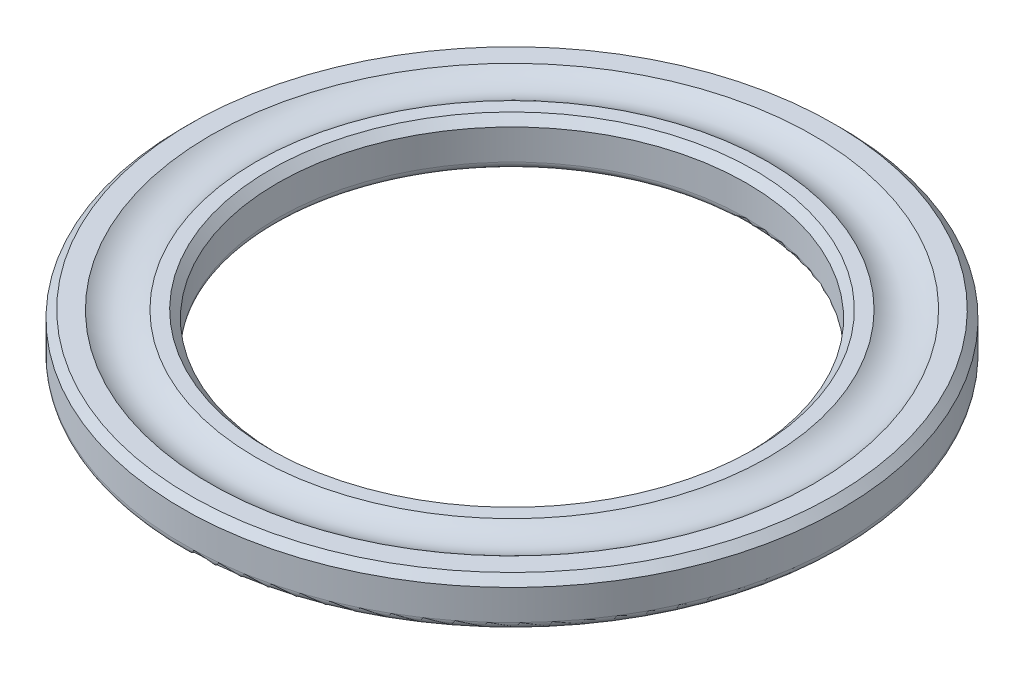
ISO-10303-21;
HEADER;
FILE_DESCRIPTION(('STEP AP214'),'2;1');
FILE_NAME('part.step','',(''),(''),'','','');
FILE_SCHEMA(('AUTOMOTIVE_DESIGN { 1 0 10303 214 1 1 1 1 }'));
ENDSEC;
DATA;
#1=APPLICATION_CONTEXT('core data for automotive mechanical design processes');
#2=APPLICATION_PROTOCOL_DEFINITION('international standard','automotive_design',2000,#1);
#3=PRODUCT_CONTEXT('',#1,'mechanical');
#4=PRODUCT('Part','Part','',(#3));
#5=PRODUCT_RELATED_PRODUCT_CATEGORY('part','',(#4));
#6=PRODUCT_DEFINITION_FORMATION('','',#4);
#7=PRODUCT_DEFINITION_CONTEXT('part definition',#1,'design');
#8=PRODUCT_DEFINITION('design','',#6,#7);
#9=PRODUCT_DEFINITION_SHAPE('','',#8);
#10=(LENGTH_UNIT() NAMED_UNIT(*) SI_UNIT(.MILLI.,.METRE.));
#11=(NAMED_UNIT(*) PLANE_ANGLE_UNIT() SI_UNIT($,.RADIAN.));
#12=(NAMED_UNIT(*) SI_UNIT($,.STERADIAN.) SOLID_ANGLE_UNIT());
#13=UNCERTAINTY_MEASURE_WITH_UNIT(LENGTH_MEASURE(1.E-05),#10,'distance_accuracy_value','');
#14=(GEOMETRIC_REPRESENTATION_CONTEXT(3) GLOBAL_UNCERTAINTY_ASSIGNED_CONTEXT((#13)) GLOBAL_UNIT_ASSIGNED_CONTEXT((#10,
#11,#12)) REPRESENTATION_CONTEXT('',''));
#15=CARTESIAN_POINT('',(0.,0.,0.));
#16=DIRECTION('',(0.,0.,1.));
#17=DIRECTION('',(1.,0.,0.));
#18=AXIS2_PLACEMENT_3D('',#15,#16,#17);
#19=CARTESIAN_POINT('',(22.25,0.,0.));
#20=DIRECTION('',(0.,-1.,0.));
#21=DIRECTION('',(-1.,0.,0.));
#22=AXIS2_PLACEMENT_3D('',#19,#20,#21);
#23=PLANE('',#22);
#24=CARTESIAN_POINT('',(0.,0.,0.));
#25=DIRECTION('',(0.,1.,0.));
#26=DIRECTION('',(1.,0.,0.));
#27=AXIS2_PLACEMENT_3D('',#24,#25,#26);
#28=CIRCLE('',#27,19.1);
#29=CARTESIAN_POINT('',(19.1,0.,0.));
#30=VERTEX_POINT('',#29);
#31=EDGE_CURVE('E11',#30,#30,#28,.T.);
#32=ORIENTED_EDGE('',*,*,#31,.T.);
#33=EDGE_LOOP('',(#32));
#34=FACE_BOUND('',#33,.T.);
#35=CARTESIAN_POINT('',(0.,0.,0.));
#36=DIRECTION('',(0.,1.,0.));
#37=DIRECTION('',(1.,0.,0.));
#38=AXIS2_PLACEMENT_3D('',#35,#36,#37);
#39=CIRCLE('',#38,25.4);
#40=CARTESIAN_POINT('',(25.4,0.,0.));
#41=VERTEX_POINT('',#40);
#42=EDGE_CURVE('E61',#41,#41,#39,.T.);
#43=ORIENTED_EDGE('',*,*,#42,.F.);
#44=EDGE_LOOP('',(#43));
#45=FACE_BOUND('',#44,.T.);
#46=ADVANCED_FACE('F16',(#34,#45),#23,.T.);
#47=CARTESIAN_POINT('',(0.,0.6,0.));
#48=DIRECTION('',(0.,1.,0.));
#49=DIRECTION('',(0.,0.,1.));
#50=AXIS2_PLACEMENT_3D('',#47,#48,#49);
#51=TOROIDAL_SURFACE('',#50,19.1,0.6);
#52=CARTESIAN_POINT('',(0.,0.6,0.));
#53=DIRECTION('',(0.,1.,0.));
#54=DIRECTION('',(1.,0.,0.));
#55=AXIS2_PLACEMENT_3D('',#52,#53,#54);
#56=CIRCLE('',#55,18.5);
#57=CARTESIAN_POINT('',(18.5,0.6,0.));
#58=VERTEX_POINT('',#57);
#59=EDGE_CURVE('E24',#58,#58,#56,.T.);
#60=ORIENTED_EDGE('',*,*,#59,.T.);
#61=EDGE_LOOP('',(#60));
#62=FACE_BOUND('',#61,.T.);
#63=ORIENTED_EDGE('',*,*,#31,.F.);
#64=EDGE_LOOP('',(#63));
#65=FACE_BOUND('',#64,.T.);
#66=ADVANCED_FACE('F18',(#62,#65),#51,.T.);
#67=CARTESIAN_POINT('',(0.,1.8,0.));
#68=DIRECTION('',(0.,-1.,0.));
#69=DIRECTION('',(1.,0.,0.));
#70=AXIS2_PLACEMENT_3D('',#67,#68,#69);
#71=CYLINDRICAL_SURFACE('',#70,18.5);
#72=CARTESIAN_POINT('',(0.,3.,0.));
#73=DIRECTION('',(0.,1.,0.));
#74=DIRECTION('',(1.,0.,0.));
#75=AXIS2_PLACEMENT_3D('',#72,#73,#74);
#76=CIRCLE('',#75,18.5);
#77=CARTESIAN_POINT('',(18.5,3.,0.));
#78=VERTEX_POINT('',#77);
#79=EDGE_CURVE('E74',#78,#78,#76,.T.);
#80=ORIENTED_EDGE('',*,*,#79,.T.);
#81=EDGE_LOOP('',(#80));
#82=FACE_BOUND('',#81,.T.);
#83=ORIENTED_EDGE('',*,*,#59,.F.);
#84=EDGE_LOOP('',(#83));
#85=FACE_BOUND('',#84,.T.);
#86=ADVANCED_FACE('F82',(#82,#85),#71,.F.);
#87=CARTESIAN_POINT('',(0.,3.3,0.));
#88=DIRECTION('',(0.,1.,0.));
#89=DIRECTION('',(1.,0.,0.));
#90=AXIS2_PLACEMENT_3D('',#87,#88,#89);
#91=CONICAL_SURFACE('',#90,18.8,0.785398163397449);
#92=CARTESIAN_POINT('',(0.,3.6,0.));
#93=DIRECTION('',(0.,1.,0.));
#94=DIRECTION('',(1.,0.,0.));
#95=AXIS2_PLACEMENT_3D('',#92,#93,#94);
#96=CIRCLE('',#95,19.1);
#97=CARTESIAN_POINT('',(19.1,3.6,0.));
#98=VERTEX_POINT('',#97);
#99=EDGE_CURVE('E71',#98,#98,#96,.T.);
#100=ORIENTED_EDGE('',*,*,#99,.T.);
#101=EDGE_LOOP('',(#100));
#102=FACE_BOUND('',#101,.T.);
#103=ORIENTED_EDGE('',*,*,#79,.F.);
#104=EDGE_LOOP('',(#103));
#105=FACE_BOUND('',#104,.T.);
#106=ADVANCED_FACE('F85',(#102,#105),#91,.F.);
#107=CARTESIAN_POINT('',(19.65,3.6,0.));
#108=DIRECTION('',(0.,1.,0.));
#109=DIRECTION('',(1.,0.,0.));
#110=AXIS2_PLACEMENT_3D('',#107,#108,#109);
#111=PLANE('',#110);
#112=CARTESIAN_POINT('',(0.,3.6,0.));
#113=DIRECTION('',(0.,1.,0.));
#114=DIRECTION('',(1.,0.,0.));
#115=AXIS2_PLACEMENT_3D('',#112,#113,#114);
#116=CIRCLE('',#115,20.2);
#117=CARTESIAN_POINT('',(20.2,3.6,0.));
#118=VERTEX_POINT('',#117);
#119=EDGE_CURVE('E70',#118,#118,#116,.T.);
#120=ORIENTED_EDGE('',*,*,#119,.T.);
#121=EDGE_LOOP('',(#120));
#122=FACE_BOUND('',#121,.T.);
#123=ORIENTED_EDGE('',*,*,#99,.F.);
#124=EDGE_LOOP('',(#123));
#125=FACE_BOUND('',#124,.T.);
#126=ADVANCED_FACE('F87',(#122,#125),#111,.T.);
#127=CARTESIAN_POINT('',(0.,6.,0.));
#128=DIRECTION('',(0.,1.,0.));
#129=DIRECTION('',(0.,0.,1.));
#130=AXIS2_PLACEMENT_3D('',#127,#128,#129);
#131=TOROIDAL_SURFACE('',#130,22.,3.);
#132=CARTESIAN_POINT('',(0.,3.6,0.));
#133=DIRECTION('',(0.,1.,0.));
#134=DIRECTION('',(1.,0.,0.));
#135=AXIS2_PLACEMENT_3D('',#132,#133,#134);
#136=CIRCLE('',#135,23.8);
#137=CARTESIAN_POINT('',(23.8,3.6,0.));
#138=VERTEX_POINT('',#137);
#139=EDGE_CURVE('E69',#138,#138,#136,.T.);
#140=ORIENTED_EDGE('',*,*,#139,.T.);
#141=EDGE_LOOP('',(#140));
#142=FACE_BOUND('',#141,.T.);
#143=ORIENTED_EDGE('',*,*,#119,.F.);
#144=EDGE_LOOP('',(#143));
#145=FACE_BOUND('',#144,.T.);
#146=ADVANCED_FACE('F95',(#142,#145),#131,.F.);
#147=CARTESIAN_POINT('',(24.6,3.6,0.));
#148=DIRECTION('',(0.,1.,0.));
#149=DIRECTION('',(1.,0.,0.));
#150=AXIS2_PLACEMENT_3D('',#147,#148,#149);
#151=PLANE('',#150);
#152=CARTESIAN_POINT('',(0.,3.6,0.));
#153=DIRECTION('',(0.,1.,0.));
#154=DIRECTION('',(1.,0.,0.));
#155=AXIS2_PLACEMENT_3D('',#152,#153,#154);
#156=CIRCLE('',#155,25.4);
#157=CARTESIAN_POINT('',(25.4,3.6,0.));
#158=VERTEX_POINT('',#157);
#159=EDGE_CURVE('E68',#158,#158,#156,.T.);
#160=ORIENTED_EDGE('',*,*,#159,.T.);
#161=EDGE_LOOP('',(#160));
#162=FACE_BOUND('',#161,.T.);
#163=ORIENTED_EDGE('',*,*,#139,.F.);
#164=EDGE_LOOP('',(#163));
#165=FACE_BOUND('',#164,.T.);
#166=ADVANCED_FACE('F106',(#162,#165),#151,.T.);
#167=CARTESIAN_POINT('',(0.,3.3,0.));
#168=DIRECTION('',(0.,-1.,0.));
#169=DIRECTION('',(1.,0.,0.));
#170=AXIS2_PLACEMENT_3D('',#167,#168,#169);
#171=CONICAL_SURFACE('',#170,25.7,0.785398163397449);
#172=CARTESIAN_POINT('',(0.,3.,0.));
#173=DIRECTION('',(0.,1.,0.));
#174=DIRECTION('',(1.,0.,0.));
#175=AXIS2_PLACEMENT_3D('',#172,#173,#174);
#176=CIRCLE('',#175,26.);
#177=CARTESIAN_POINT('',(26.,3.,0.));
#178=VERTEX_POINT('',#177);
#179=EDGE_CURVE('E63',#178,#178,#176,.T.);
#180=ORIENTED_EDGE('',*,*,#179,.T.);
#181=EDGE_LOOP('',(#180));
#182=FACE_BOUND('',#181,.T.);
#183=ORIENTED_EDGE('',*,*,#159,.F.);
#184=EDGE_LOOP('',(#183));
#185=FACE_BOUND('',#184,.T.);
#186=ADVANCED_FACE('F110',(#182,#185),#171,.T.);
#187=CARTESIAN_POINT('',(0.,1.8,0.));
#188=DIRECTION('',(0.,-1.,0.));
#189=DIRECTION('',(1.,0.,0.));
#190=AXIS2_PLACEMENT_3D('',#187,#188,#189);
#191=CYLINDRICAL_SURFACE('',#190,26.);
#192=CARTESIAN_POINT('',(0.,0.6,0.));
#193=DIRECTION('',(0.,1.,0.));
#194=DIRECTION('',(1.,0.,0.));
#195=AXIS2_PLACEMENT_3D('',#192,#193,#194);
#196=CIRCLE('',#195,26.);
#197=CARTESIAN_POINT('',(26.,0.6,0.));
#198=VERTEX_POINT('',#197);
#199=EDGE_CURVE('E57',#198,#198,#196,.T.);
#200=ORIENTED_EDGE('',*,*,#199,.T.);
#201=EDGE_LOOP('',(#200));
#202=FACE_BOUND('',#201,.T.);
#203=ORIENTED_EDGE('',*,*,#179,.F.);
#204=EDGE_LOOP('',(#203));
#205=FACE_BOUND('',#204,.T.);
#206=ADVANCED_FACE('F58',(#202,#205),#191,.T.);
#207=CARTESIAN_POINT('',(0.,0.6,0.));
#208=DIRECTION('',(0.,1.,0.));
#209=DIRECTION('',(0.,0.,1.));
#210=AXIS2_PLACEMENT_3D('',#207,#208,#209);
#211=TOROIDAL_SURFACE('',#210,25.4,0.6);
#212=ORIENTED_EDGE('',*,*,#42,.T.);
#213=EDGE_LOOP('',(#212));
#214=FACE_BOUND('',#213,.T.);
#215=ORIENTED_EDGE('',*,*,#199,.F.);
#216=EDGE_LOOP('',(#215));
#217=FACE_BOUND('',#216,.T.);
#218=ADVANCED_FACE('F120',(#214,#217),#211,.T.);
#219=CLOSED_SHELL('',(#46,#66,#86,#106,#126,#146,#166,#186,#206,#218));
#220=MANIFOLD_SOLID_BREP('B1',#219);
#221=ADVANCED_BREP_SHAPE_REPRESENTATION('',(#18,#220),#14);
#222=SHAPE_DEFINITION_REPRESENTATION(#9,#221);
ENDSEC;
END-ISO-10303-21;
